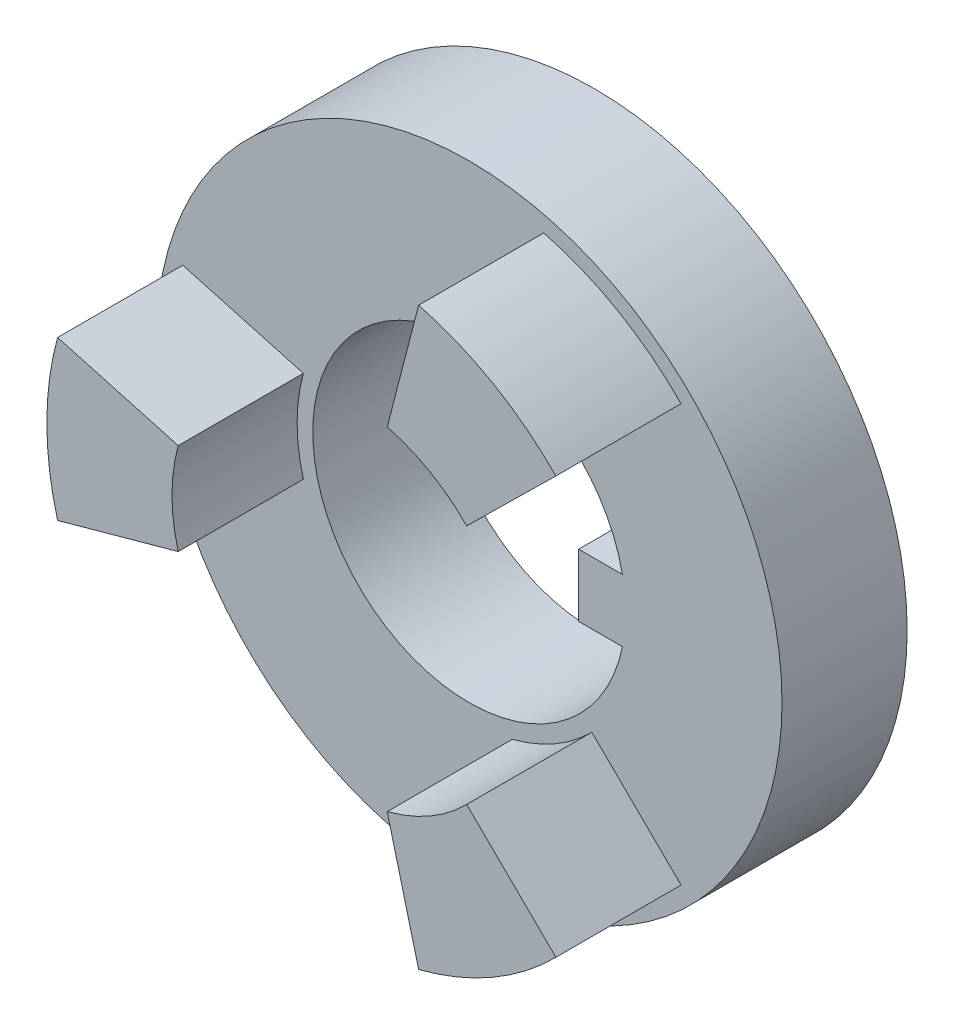
ISO-10303-21;
HEADER;
FILE_DESCRIPTION(('STEP AP214'),'2;1');
FILE_NAME('part.step','',(''),(''),'','','');
FILE_SCHEMA(('AUTOMOTIVE_DESIGN { 1 0 10303 214 1 1 1 1 }'));
ENDSEC;
DATA;
#1=APPLICATION_CONTEXT('core data for automotive mechanical design processes');
#2=APPLICATION_PROTOCOL_DEFINITION('international standard','automotive_design',2000,#1);
#3=PRODUCT_CONTEXT('',#1,'mechanical');
#4=PRODUCT('Part','Part','',(#3));
#5=PRODUCT_RELATED_PRODUCT_CATEGORY('part','',(#4));
#6=PRODUCT_DEFINITION_FORMATION('','',#4);
#7=PRODUCT_DEFINITION_CONTEXT('part definition',#1,'design');
#8=PRODUCT_DEFINITION('design','',#6,#7);
#9=PRODUCT_DEFINITION_SHAPE('','',#8);
#10=(LENGTH_UNIT() NAMED_UNIT(*) SI_UNIT(.MILLI.,.METRE.));
#11=(NAMED_UNIT(*) PLANE_ANGLE_UNIT() SI_UNIT($,.RADIAN.));
#12=(NAMED_UNIT(*) SI_UNIT($,.STERADIAN.) SOLID_ANGLE_UNIT());
#13=UNCERTAINTY_MEASURE_WITH_UNIT(LENGTH_MEASURE(1.E-05),#10,'distance_accuracy_value','');
#14=(GEOMETRIC_REPRESENTATION_CONTEXT(3) GLOBAL_UNCERTAINTY_ASSIGNED_CONTEXT((#13)) GLOBAL_UNIT_ASSIGNED_CONTEXT((#10,
#11,#12)) REPRESENTATION_CONTEXT('',''));
#15=CARTESIAN_POINT('',(0.,0.,0.));
#16=DIRECTION('',(0.,0.,1.));
#17=DIRECTION('',(1.,0.,0.));
#18=AXIS2_PLACEMENT_3D('',#15,#16,#17);
#19=CARTESIAN_POINT('',(0.,0.,4.));
#20=DIRECTION('',(0.,0.,1.));
#21=DIRECTION('',(1.,0.,0.));
#22=AXIS2_PLACEMENT_3D('',#19,#20,#21);
#23=PLANE('',#22);
#24=DIRECTION('',(-1.,0.,0.));
#25=VECTOR('',#24,1.);
#26=CARTESIAN_POINT('',(6.5,-1.,4.));
#27=LINE('',#26,#25);
#28=CARTESIAN_POINT('',(4.89897948556636,-1.,4.));
#29=VERTEX_POINT('',#28);
#30=CARTESIAN_POINT('',(3.5,-1.,4.));
#31=VERTEX_POINT('',#30);
#32=EDGE_CURVE('E156',#29,#31,#27,.T.);
#33=ORIENTED_EDGE('',*,*,#32,.F.);
#34=CARTESIAN_POINT('',(0.,0.,4.));
#35=DIRECTION('',(0.,0.,1.));
#36=DIRECTION('',(1.,0.,0.));
#37=AXIS2_PLACEMENT_3D('',#34,#35,#36);
#38=CIRCLE('',#37,5.);
#39=CARTESIAN_POINT('',(4.89897948556636,1.,4.));
#40=VERTEX_POINT('',#39);
#41=EDGE_CURVE('E164',#40,#29,#38,.T.);
#42=ORIENTED_EDGE('',*,*,#41,.F.);
#43=DIRECTION('',(1.,0.,0.));
#44=VECTOR('',#43,1.);
#45=CARTESIAN_POINT('',(6.5,1.,4.));
#46=LINE('',#45,#44);
#47=CARTESIAN_POINT('',(3.5,1.,4.));
#48=VERTEX_POINT('',#47);
#49=EDGE_CURVE('E150',#48,#40,#46,.T.);
#50=ORIENTED_EDGE('',*,*,#49,.F.);
#51=DIRECTION('',(0.,1.,0.));
#52=VECTOR('',#51,1.);
#53=CARTESIAN_POINT('',(3.5,1.,4.));
#54=LINE('',#53,#52);
#55=EDGE_CURVE('E162',#31,#48,#54,.T.);
#56=ORIENTED_EDGE('',*,*,#55,.F.);
#57=EDGE_LOOP('',(#33,#42,#50,#56));
#58=FACE_BOUND('',#57,.T.);
#59=CARTESIAN_POINT('',(0.,0.,4.));
#60=DIRECTION('',(0.,0.,1.));
#61=DIRECTION('',(1.,0.,0.));
#62=AXIS2_PLACEMENT_3D('',#59,#60,#61);
#63=CIRCLE('',#62,5.5);
#64=CARTESIAN_POINT('',(3.92058984626385,3.85732747603526,4.));
#65=VERTEX_POINT('',#64);
#66=CARTESIAN_POINT('',(1.3802486618295,5.32399414270192,4.));
#67=VERTEX_POINT('',#66);
#68=EDGE_CURVE('E177',#65,#67,#63,.T.);
#69=ORIENTED_EDGE('',*,*,#68,.T.);
#70=DIRECTION('',(0.250954302150848,0.967998935036594,0.));
#71=VECTOR('',#70,1.);
#72=CARTESIAN_POINT('',(-3.16741076286094E-13,0.,4.));
#73=LINE('',#72,#71);
#74=CARTESIAN_POINT('',(2.38406587043289,9.1959898828483,4.));
#75=VERTEX_POINT('',#74);
#76=EDGE_CURVE('E183',#67,#75,#73,.T.);
#77=ORIENTED_EDGE('',*,*,#76,.T.);
#78=CARTESIAN_POINT('',(0.,0.,4.));
#79=DIRECTION('',(0.,0.,1.));
#80=DIRECTION('',(1.,0.,0.));
#81=AXIS2_PLACEMENT_3D('',#78,#79,#80);
#82=CIRCLE('',#81,9.5);
#83=CARTESIAN_POINT('',(6.7719279162738,6.66265654951473,4.));
#84=VERTEX_POINT('',#83);
#85=EDGE_CURVE('E193',#84,#75,#82,.T.);
#86=ORIENTED_EDGE('',*,*,#85,.F.);
#87=DIRECTION('',(0.712834517502549,0.701332268369928,0.));
#88=VECTOR('',#87,1.);
#89=CARTESIAN_POINT('',(-4.08479342547263E-13,4.1517863669842E-13,4.));
#90=LINE('',#89,#88);
#91=EDGE_CURVE('E58',#65,#84,#90,.T.);
#92=ORIENTED_EDGE('',*,*,#91,.F.);
#93=EDGE_LOOP('',(#69,#77,#86,#92));
#94=FACE_BOUND('',#93,.T.);
#95=CARTESIAN_POINT('',(0.,0.,4.));
#96=DIRECTION('',(0.,0.,1.));
#97=DIRECTION('',(1.,0.,0.));
#98=AXIS2_PLACEMENT_3D('',#95,#96,#97);
#99=CIRCLE('',#98,5.5);
#100=CARTESIAN_POINT('',(1.38024866183015,-5.3239941427008,4.));
#101=VERTEX_POINT('',#100);
#102=CARTESIAN_POINT('',(3.9205898462645,-3.85732747603413,4.));
#103=VERTEX_POINT('',#102);
#104=EDGE_CURVE('E207',#101,#103,#99,.T.);
#105=ORIENTED_EDGE('',*,*,#104,.T.);
#106=DIRECTION('',(0.712834517502549,-0.701332268369927,0.));
#107=VECTOR('',#106,1.);
#108=CARTESIAN_POINT('',(4.70526837617733E-13,4.78243746070332E-13,4.));
#109=LINE('',#108,#107);
#110=CARTESIAN_POINT('',(6.7719279162747,-6.66265654951384,4.));
#111=VERTEX_POINT('',#110);
#112=EDGE_CURVE('E212',#103,#111,#109,.T.);
#113=ORIENTED_EDGE('',*,*,#112,.T.);
#114=CARTESIAN_POINT('',(0.,0.,4.));
#115=DIRECTION('',(0.,0.,1.));
#116=DIRECTION('',(1.,0.,0.));
#117=AXIS2_PLACEMENT_3D('',#114,#115,#116);
#118=CIRCLE('',#117,9.5);
#119=CARTESIAN_POINT('',(2.38406587043363,-9.1959898828475,4.));
#120=VERTEX_POINT('',#119);
#121=EDGE_CURVE('E224',#120,#111,#118,.T.);
#122=ORIENTED_EDGE('',*,*,#121,.F.);
#123=DIRECTION('',(0.250954302150849,-0.967998935036594,0.));
#124=VECTOR('',#123,1.);
#125=CARTESIAN_POINT('',(5.63165213834055E-13,1.46000918098134E-13,4.));
#126=LINE('',#125,#124);
#127=EDGE_CURVE('E221',#101,#120,#126,.T.);
#128=ORIENTED_EDGE('',*,*,#127,.F.);
#129=EDGE_LOOP('',(#105,#113,#122,#128));
#130=FACE_BOUND('',#129,.T.);
#131=CARTESIAN_POINT('',(0.,0.,4.));
#132=DIRECTION('',(0.,0.,1.));
#133=DIRECTION('',(1.,0.,0.));
#134=AXIS2_PLACEMENT_3D('',#131,#132,#133);
#135=CIRCLE('',#134,5.5);
#136=CARTESIAN_POINT('',(-5.30083850809369,1.46666666666667,4.));
#137=VERTEX_POINT('',#136);
#138=CARTESIAN_POINT('',(-5.30083850809369,-1.46666666666666,4.));
#139=VERTEX_POINT('',#138);
#140=EDGE_CURVE('E239',#137,#139,#135,.T.);
#141=ORIENTED_EDGE('',*,*,#140,.T.);
#142=DIRECTION('',(-0.963788819653398,-0.266666666666666,0.));
#143=VECTOR('',#142,1.);
#144=CARTESIAN_POINT('',(0.,0.,4.));
#145=LINE('',#144,#143);
#146=CARTESIAN_POINT('',(-9.15599378670728,-2.53333333333333,4.));
#147=VERTEX_POINT('',#146);
#148=EDGE_CURVE('E244',#139,#147,#145,.T.);
#149=ORIENTED_EDGE('',*,*,#148,.T.);
#150=CARTESIAN_POINT('',(0.,0.,4.));
#151=DIRECTION('',(0.,0.,1.));
#152=DIRECTION('',(1.,0.,0.));
#153=AXIS2_PLACEMENT_3D('',#150,#151,#152);
#154=CIRCLE('',#153,9.5);
#155=CARTESIAN_POINT('',(-9.15599378670728,2.53333333333333,4.));
#156=VERTEX_POINT('',#155);
#157=EDGE_CURVE('E256',#156,#147,#154,.T.);
#158=ORIENTED_EDGE('',*,*,#157,.F.);
#159=DIRECTION('',(-0.963788819653397,0.266666666666667,0.));
#160=VECTOR('',#159,1.);
#161=CARTESIAN_POINT('',(0.,0.,4.));
#162=LINE('',#161,#160);
#163=EDGE_CURVE('E253',#137,#156,#162,.T.);
#164=ORIENTED_EDGE('',*,*,#163,.F.);
#165=EDGE_LOOP('',(#141,#149,#158,#164));
#166=FACE_BOUND('',#165,.T.);
#167=CARTESIAN_POINT('',(0.,0.,4.));
#168=DIRECTION('',(0.,0.,1.));
#169=DIRECTION('',(1.,0.,0.));
#170=AXIS2_PLACEMENT_3D('',#167,#168,#169);
#171=CIRCLE('',#170,10.);
#172=CARTESIAN_POINT('',(10.,0.,4.));
#173=VERTEX_POINT('',#172);
#174=EDGE_CURVE('E275',#173,#173,#171,.T.);
#175=ORIENTED_EDGE('',*,*,#174,.T.);
#176=EDGE_LOOP('',(#175));
#177=FACE_BOUND('',#176,.T.);
#178=ADVANCED_FACE('F35',(#58,#94,#130,#166,#177),#23,.T.);
#179=CARTESIAN_POINT('',(0.,0.,0.));
#180=DIRECTION('',(0.,0.,1.));
#181=DIRECTION('',(1.,0.,0.));
#182=AXIS2_PLACEMENT_3D('',#179,#180,#181);
#183=PLANE('',#182);
#184=CARTESIAN_POINT('',(0.,0.,0.));
#185=DIRECTION('',(0.,0.,1.));
#186=DIRECTION('',(1.,0.,0.));
#187=AXIS2_PLACEMENT_3D('',#184,#185,#186);
#188=CIRCLE('',#187,10.);
#189=CARTESIAN_POINT('',(10.,0.,0.));
#190=VERTEX_POINT('',#189);
#191=EDGE_CURVE('E273',#190,#190,#188,.T.);
#192=ORIENTED_EDGE('',*,*,#191,.F.);
#193=EDGE_LOOP('',(#192));
#194=FACE_BOUND('',#193,.T.);
#195=CARTESIAN_POINT('',(0.,0.,0.));
#196=DIRECTION('',(0.,0.,1.));
#197=DIRECTION('',(1.,0.,0.));
#198=AXIS2_PLACEMENT_3D('',#195,#196,#197);
#199=CIRCLE('',#198,5.);
#200=CARTESIAN_POINT('',(4.89897948556636,1.,0.));
#201=VERTEX_POINT('',#200);
#202=CARTESIAN_POINT('',(4.89897948556636,-1.,0.));
#203=VERTEX_POINT('',#202);
#204=EDGE_CURVE('E271',#201,#203,#199,.T.);
#205=ORIENTED_EDGE('',*,*,#204,.T.);
#206=DIRECTION('',(-1.,0.,0.));
#207=VECTOR('',#206,1.);
#208=CARTESIAN_POINT('',(6.5,-1.,0.));
#209=LINE('',#208,#207);
#210=CARTESIAN_POINT('',(3.5,-1.,0.));
#211=VERTEX_POINT('',#210);
#212=EDGE_CURVE('E169',#203,#211,#209,.T.);
#213=ORIENTED_EDGE('',*,*,#212,.T.);
#214=DIRECTION('',(0.,1.,0.));
#215=VECTOR('',#214,1.);
#216=CARTESIAN_POINT('',(3.5,1.,0.));
#217=LINE('',#216,#215);
#218=CARTESIAN_POINT('',(3.5,1.,0.));
#219=VERTEX_POINT('',#218);
#220=EDGE_CURVE('E174',#211,#219,#217,.T.);
#221=ORIENTED_EDGE('',*,*,#220,.T.);
#222=DIRECTION('',(1.,0.,0.));
#223=VECTOR('',#222,1.);
#224=CARTESIAN_POINT('',(6.5,1.,0.));
#225=LINE('',#224,#223);
#226=EDGE_CURVE('E50',#219,#201,#225,.T.);
#227=ORIENTED_EDGE('',*,*,#226,.T.);
#228=EDGE_LOOP('',(#205,#213,#221,#227));
#229=FACE_BOUND('',#228,.T.);
#230=ADVANCED_FACE('F283',(#194,#229),#183,.F.);
#231=CARTESIAN_POINT('',(0.,0.,4.));
#232=DIRECTION('',(0.,0.,-1.));
#233=DIRECTION('',(-1.,0.,0.));
#234=AXIS2_PLACEMENT_3D('',#231,#232,#233);
#235=CYLINDRICAL_SURFACE('',#234,10.);
#236=ORIENTED_EDGE('',*,*,#174,.F.);
#237=EDGE_LOOP('',(#236));
#238=FACE_BOUND('',#237,.T.);
#239=ORIENTED_EDGE('',*,*,#191,.T.);
#240=EDGE_LOOP('',(#239));
#241=FACE_BOUND('',#240,.T.);
#242=ADVANCED_FACE('F37',(#238,#241),#235,.T.);
#243=CARTESIAN_POINT('',(0.,0.,4.));
#244=DIRECTION('',(0.,0.,-1.));
#245=DIRECTION('',(-1.,0.,0.));
#246=AXIS2_PLACEMENT_3D('',#243,#244,#245);
#247=CYLINDRICAL_SURFACE('',#246,5.);
#248=DIRECTION('',(0.,0.,-1.));
#249=VECTOR('',#248,1.);
#250=CARTESIAN_POINT('',(4.89897948556636,-1.,4.));
#251=LINE('',#250,#249);
#252=EDGE_CURVE('E11',#203,#29,#251,.F.);
#253=ORIENTED_EDGE('',*,*,#252,.F.);
#254=ORIENTED_EDGE('',*,*,#204,.F.);
#255=DIRECTION('',(0.,0.,-1.));
#256=VECTOR('',#255,1.);
#257=CARTESIAN_POINT('',(4.89897948556636,1.,4.));
#258=LINE('',#257,#256);
#259=EDGE_CURVE('E43',#40,#201,#258,.T.);
#260=ORIENTED_EDGE('',*,*,#259,.F.);
#261=ORIENTED_EDGE('',*,*,#41,.T.);
#262=EDGE_LOOP('',(#253,#254,#260,#261));
#263=FACE_BOUND('',#262,.T.);
#264=ADVANCED_FACE('F282',(#263),#247,.F.);
#265=CARTESIAN_POINT('',(0.,0.,8.));
#266=DIRECTION('',(0.,0.,-1.));
#267=DIRECTION('',(-1.,0.,0.));
#268=AXIS2_PLACEMENT_3D('',#265,#266,#267);
#269=CYLINDRICAL_SURFACE('',#268,5.5);
#270=ORIENTED_EDGE('',*,*,#140,.F.);
#271=DIRECTION('',(0.,0.,-1.));
#272=VECTOR('',#271,1.);
#273=CARTESIAN_POINT('',(-5.30083850809369,1.46666666666667,8.));
#274=LINE('',#273,#272);
#275=CARTESIAN_POINT('',(-5.30083850809369,1.46666666666667,8.));
#276=VERTEX_POINT('',#275);
#277=EDGE_CURVE('E268',#276,#137,#274,.T.);
#278=ORIENTED_EDGE('',*,*,#277,.F.);
#279=CARTESIAN_POINT('',(0.,0.,8.));
#280=DIRECTION('',(0.,0.,1.));
#281=DIRECTION('',(1.,0.,0.));
#282=AXIS2_PLACEMENT_3D('',#279,#280,#281);
#283=CIRCLE('',#282,5.5);
#284=CARTESIAN_POINT('',(-5.30083850809369,-1.46666666666666,8.));
#285=VERTEX_POINT('',#284);
#286=EDGE_CURVE('E240',#276,#285,#283,.T.);
#287=ORIENTED_EDGE('',*,*,#286,.T.);
#288=DIRECTION('',(0.,0.,-1.));
#289=VECTOR('',#288,1.);
#290=CARTESIAN_POINT('',(-5.30083850809369,-1.46666666666666,8.));
#291=LINE('',#290,#289);
#292=EDGE_CURVE('E251',#285,#139,#291,.T.);
#293=ORIENTED_EDGE('',*,*,#292,.T.);
#294=EDGE_LOOP('',(#270,#278,#287,#293));
#295=FACE_BOUND('',#294,.T.);
#296=ADVANCED_FACE('F304',(#295),#269,.F.);
#297=CARTESIAN_POINT('',(0.,0.,8.));
#298=DIRECTION('',(-0.266666666666667,-0.963788819653397,0.));
#299=DIRECTION('',(0.963788819653397,-0.266666666666667,0.));
#300=AXIS2_PLACEMENT_3D('',#297,#298,#299);
#301=PLANE('',#300);
#302=ORIENTED_EDGE('',*,*,#163,.T.);
#303=DIRECTION('',(0.,0.,-1.));
#304=VECTOR('',#303,1.);
#305=CARTESIAN_POINT('',(-9.15599378670728,2.53333333333333,8.));
#306=LINE('',#305,#304);
#307=CARTESIAN_POINT('',(-9.15599378670728,2.53333333333333,8.));
#308=VERTEX_POINT('',#307);
#309=EDGE_CURVE('E265',#308,#156,#306,.T.);
#310=ORIENTED_EDGE('',*,*,#309,.F.);
#311=DIRECTION('',(-0.963788819653397,0.266666666666667,0.));
#312=VECTOR('',#311,1.);
#313=CARTESIAN_POINT('',(0.,0.,8.));
#314=LINE('',#313,#312);
#315=EDGE_CURVE('E243',#276,#308,#314,.T.);
#316=ORIENTED_EDGE('',*,*,#315,.F.);
#317=ORIENTED_EDGE('',*,*,#277,.T.);
#318=EDGE_LOOP('',(#302,#310,#316,#317));
#319=FACE_BOUND('',#318,.T.);
#320=ADVANCED_FACE('F307',(#319),#301,.F.);
#321=CARTESIAN_POINT('',(0.,0.,8.));
#322=DIRECTION('',(0.,0.,-1.));
#323=DIRECTION('',(-1.,0.,0.));
#324=AXIS2_PLACEMENT_3D('',#321,#322,#323);
#325=CYLINDRICAL_SURFACE('',#324,9.5);
#326=ORIENTED_EDGE('',*,*,#157,.T.);
#327=DIRECTION('',(0.,0.,-1.));
#328=VECTOR('',#327,1.);
#329=CARTESIAN_POINT('',(-9.15599378670728,-2.53333333333333,8.));
#330=LINE('',#329,#328);
#331=CARTESIAN_POINT('',(-9.15599378670728,-2.53333333333333,8.));
#332=VERTEX_POINT('',#331);
#333=EDGE_CURVE('E262',#332,#147,#330,.T.);
#334=ORIENTED_EDGE('',*,*,#333,.F.);
#335=CARTESIAN_POINT('',(0.,0.,8.));
#336=DIRECTION('',(0.,0.,1.));
#337=DIRECTION('',(1.,0.,0.));
#338=AXIS2_PLACEMENT_3D('',#335,#336,#337);
#339=CIRCLE('',#338,9.5);
#340=EDGE_CURVE('E246',#308,#332,#339,.T.);
#341=ORIENTED_EDGE('',*,*,#340,.F.);
#342=ORIENTED_EDGE('',*,*,#309,.T.);
#343=EDGE_LOOP('',(#326,#334,#341,#342));
#344=FACE_BOUND('',#343,.T.);
#345=ADVANCED_FACE('F311',(#344),#325,.T.);
#346=CARTESIAN_POINT('',(0.,0.,8.));
#347=DIRECTION('',(0.266666666666666,-0.963788819653398,0.));
#348=DIRECTION('',(0.963788819653398,0.266666666666666,0.));
#349=AXIS2_PLACEMENT_3D('',#346,#347,#348);
#350=PLANE('',#349);
#351=ORIENTED_EDGE('',*,*,#148,.F.);
#352=ORIENTED_EDGE('',*,*,#292,.F.);
#353=DIRECTION('',(-0.963788819653398,-0.266666666666666,0.));
#354=VECTOR('',#353,1.);
#355=CARTESIAN_POINT('',(0.,0.,8.));
#356=LINE('',#355,#354);
#357=EDGE_CURVE('E248',#285,#332,#356,.T.);
#358=ORIENTED_EDGE('',*,*,#357,.T.);
#359=ORIENTED_EDGE('',*,*,#333,.T.);
#360=EDGE_LOOP('',(#351,#352,#358,#359));
#361=FACE_BOUND('',#360,.T.);
#362=ADVANCED_FACE('F315',(#361),#350,.T.);
#363=CARTESIAN_POINT('',(0.,0.,8.));
#364=DIRECTION('',(0.,0.,1.));
#365=DIRECTION('',(1.,0.,0.));
#366=AXIS2_PLACEMENT_3D('',#363,#364,#365);
#367=PLANE('',#366);
#368=ORIENTED_EDGE('',*,*,#286,.F.);
#369=ORIENTED_EDGE('',*,*,#315,.T.);
#370=ORIENTED_EDGE('',*,*,#340,.T.);
#371=ORIENTED_EDGE('',*,*,#357,.F.);
#372=EDGE_LOOP('',(#368,#369,#370,#371));
#373=FACE_BOUND('',#372,.T.);
#374=ADVANCED_FACE('F319',(#373),#367,.T.);
#375=CARTESIAN_POINT('',(0.,0.,8.));
#376=DIRECTION('',(0.,0.,-1.));
#377=DIRECTION('',(-1.,0.,0.));
#378=AXIS2_PLACEMENT_3D('',#375,#376,#377);
#379=CYLINDRICAL_SURFACE('',#378,5.5);
#380=ORIENTED_EDGE('',*,*,#104,.F.);
#381=DIRECTION('',(0.,0.,-1.));
#382=VECTOR('',#381,1.);
#383=CARTESIAN_POINT('',(1.38024866183015,-5.3239941427008,8.));
#384=LINE('',#383,#382);
#385=CARTESIAN_POINT('',(1.38024866183015,-5.3239941427008,8.));
#386=VERTEX_POINT('',#385);
#387=EDGE_CURVE('E236',#386,#101,#384,.T.);
#388=ORIENTED_EDGE('',*,*,#387,.F.);
#389=CARTESIAN_POINT('',(0.,0.,8.));
#390=DIRECTION('',(0.,0.,1.));
#391=DIRECTION('',(1.,0.,0.));
#392=AXIS2_PLACEMENT_3D('',#389,#390,#391);
#393=CIRCLE('',#392,5.5);
#394=CARTESIAN_POINT('',(3.9205898462645,-3.85732747603413,8.));
#395=VERTEX_POINT('',#394);
#396=EDGE_CURVE('E208',#386,#395,#393,.T.);
#397=ORIENTED_EDGE('',*,*,#396,.T.);
#398=DIRECTION('',(0.,0.,-1.));
#399=VECTOR('',#398,1.);
#400=CARTESIAN_POINT('',(3.9205898462645,-3.85732747603413,8.));
#401=LINE('',#400,#399);
#402=EDGE_CURVE('E219',#395,#103,#401,.T.);
#403=ORIENTED_EDGE('',*,*,#402,.T.);
#404=EDGE_LOOP('',(#380,#388,#397,#403));
#405=FACE_BOUND('',#404,.T.);
#406=ADVANCED_FACE('F323',(#405),#379,.F.);
#407=CARTESIAN_POINT('',(5.63165213834055E-13,1.46000918098134E-13,8.));
#408=DIRECTION('',(0.967998935036594,0.250954302150849,0.));
#409=DIRECTION('',(-0.250954302150849,0.967998935036594,0.));
#410=AXIS2_PLACEMENT_3D('',#407,#408,#409);
#411=PLANE('',#410);
#412=ORIENTED_EDGE('',*,*,#127,.T.);
#413=DIRECTION('',(0.,0.,-1.));
#414=VECTOR('',#413,1.);
#415=CARTESIAN_POINT('',(2.38406587043355,-9.19598988284717,8.));
#416=LINE('',#415,#414);
#417=CARTESIAN_POINT('',(2.38406587043355,-9.19598988284717,8.));
#418=VERTEX_POINT('',#417);
#419=EDGE_CURVE('E233',#418,#120,#416,.T.);
#420=ORIENTED_EDGE('',*,*,#419,.F.);
#421=DIRECTION('',(0.250954302150849,-0.967998935036594,0.));
#422=VECTOR('',#421,1.);
#423=CARTESIAN_POINT('',(5.63165213834055E-13,1.46000918098134E-13,8.));
#424=LINE('',#423,#422);
#425=EDGE_CURVE('E211',#386,#418,#424,.T.);
#426=ORIENTED_EDGE('',*,*,#425,.F.);
#427=ORIENTED_EDGE('',*,*,#387,.T.);
#428=EDGE_LOOP('',(#412,#420,#426,#427));
#429=FACE_BOUND('',#428,.T.);
#430=ADVANCED_FACE('F327',(#429),#411,.F.);
#431=CARTESIAN_POINT('',(0.,0.,8.));
#432=DIRECTION('',(0.,0.,-1.));
#433=DIRECTION('',(-1.,0.,0.));
#434=AXIS2_PLACEMENT_3D('',#431,#432,#433);
#435=CYLINDRICAL_SURFACE('',#434,9.5);
#436=ORIENTED_EDGE('',*,*,#121,.T.);
#437=DIRECTION('',(0.,0.,-1.));
#438=VECTOR('',#437,1.);
#439=CARTESIAN_POINT('',(6.7719279162747,-6.66265654951384,8.));
#440=LINE('',#439,#438);
#441=CARTESIAN_POINT('',(6.7719279162747,-6.66265654951384,8.));
#442=VERTEX_POINT('',#441);
#443=EDGE_CURVE('E230',#442,#111,#440,.T.);
#444=ORIENTED_EDGE('',*,*,#443,.F.);
#445=CARTESIAN_POINT('',(0.,0.,8.));
#446=DIRECTION('',(0.,0.,1.));
#447=DIRECTION('',(1.,0.,0.));
#448=AXIS2_PLACEMENT_3D('',#445,#446,#447);
#449=CIRCLE('',#448,9.5);
#450=EDGE_CURVE('E214',#418,#442,#449,.T.);
#451=ORIENTED_EDGE('',*,*,#450,.F.);
#452=ORIENTED_EDGE('',*,*,#419,.T.);
#453=EDGE_LOOP('',(#436,#444,#451,#452));
#454=FACE_BOUND('',#453,.T.);
#455=ADVANCED_FACE('F331',(#454),#435,.T.);
#456=CARTESIAN_POINT('',(4.70526837617733E-13,4.78243746070332E-13,8.));
#457=DIRECTION('',(0.701332268369927,0.712834517502549,0.));
#458=DIRECTION('',(-0.712834517502549,0.701332268369927,0.));
#459=AXIS2_PLACEMENT_3D('',#456,#457,#458);
#460=PLANE('',#459);
#461=ORIENTED_EDGE('',*,*,#112,.F.);
#462=ORIENTED_EDGE('',*,*,#402,.F.);
#463=DIRECTION('',(0.712834517502549,-0.701332268369927,0.));
#464=VECTOR('',#463,1.);
#465=CARTESIAN_POINT('',(4.70526837617733E-13,4.78243746070332E-13,8.));
#466=LINE('',#465,#464);
#467=EDGE_CURVE('E216',#395,#442,#466,.T.);
#468=ORIENTED_EDGE('',*,*,#467,.T.);
#469=ORIENTED_EDGE('',*,*,#443,.T.);
#470=EDGE_LOOP('',(#461,#462,#468,#469));
#471=FACE_BOUND('',#470,.T.);
#472=ADVANCED_FACE('F335',(#471),#460,.T.);
#473=CARTESIAN_POINT('',(0.,0.,8.));
#474=DIRECTION('',(0.,0.,1.));
#475=DIRECTION('',(1.,0.,0.));
#476=AXIS2_PLACEMENT_3D('',#473,#474,#475);
#477=PLANE('',#476);
#478=ORIENTED_EDGE('',*,*,#396,.F.);
#479=ORIENTED_EDGE('',*,*,#425,.T.);
#480=ORIENTED_EDGE('',*,*,#450,.T.);
#481=ORIENTED_EDGE('',*,*,#467,.F.);
#482=EDGE_LOOP('',(#478,#479,#480,#481));
#483=FACE_BOUND('',#482,.T.);
#484=ADVANCED_FACE('F339',(#483),#477,.T.);
#485=CARTESIAN_POINT('',(0.,0.,8.));
#486=DIRECTION('',(0.,0.,-1.));
#487=DIRECTION('',(-1.,0.,0.));
#488=AXIS2_PLACEMENT_3D('',#485,#486,#487);
#489=CYLINDRICAL_SURFACE('',#488,5.5);
#490=ORIENTED_EDGE('',*,*,#68,.F.);
#491=DIRECTION('',(0.,0.,-1.));
#492=VECTOR('',#491,1.);
#493=CARTESIAN_POINT('',(3.92058984626385,3.85732747603526,8.));
#494=LINE('',#493,#492);
#495=CARTESIAN_POINT('',(3.92058984626385,3.85732747603526,8.));
#496=VERTEX_POINT('',#495);
#497=EDGE_CURVE('E205',#496,#65,#494,.T.);
#498=ORIENTED_EDGE('',*,*,#497,.F.);
#499=CARTESIAN_POINT('',(0.,0.,8.));
#500=DIRECTION('',(0.,0.,1.));
#501=DIRECTION('',(1.,0.,0.));
#502=AXIS2_PLACEMENT_3D('',#499,#500,#501);
#503=CIRCLE('',#502,5.5);
#504=CARTESIAN_POINT('',(1.3802486618295,5.32399414270192,8.));
#505=VERTEX_POINT('',#504);
#506=EDGE_CURVE('E179',#496,#505,#503,.T.);
#507=ORIENTED_EDGE('',*,*,#506,.T.);
#508=DIRECTION('',(0.,0.,-1.));
#509=VECTOR('',#508,1.);
#510=CARTESIAN_POINT('',(1.3802486618295,5.32399414270192,8.));
#511=LINE('',#510,#509);
#512=EDGE_CURVE('E190',#505,#67,#511,.T.);
#513=ORIENTED_EDGE('',*,*,#512,.T.);
#514=EDGE_LOOP('',(#490,#498,#507,#513));
#515=FACE_BOUND('',#514,.T.);
#516=ADVANCED_FACE('F343',(#515),#489,.F.);
#517=CARTESIAN_POINT('',(-4.08479342547263E-13,4.1517863669842E-13,8.));
#518=DIRECTION('',(-0.701332268369928,0.712834517502549,0.));
#519=DIRECTION('',(-0.712834517502549,-0.701332268369928,0.));
#520=AXIS2_PLACEMENT_3D('',#517,#518,#519);
#521=PLANE('',#520);
#522=ORIENTED_EDGE('',*,*,#91,.T.);
#523=DIRECTION('',(0.,0.,-1.));
#524=VECTOR('',#523,1.);
#525=CARTESIAN_POINT('',(6.77192791627404,6.66265654951497,8.));
#526=LINE('',#525,#524);
#527=CARTESIAN_POINT('',(6.77192791627404,6.66265654951497,8.));
#528=VERTEX_POINT('',#527);
#529=EDGE_CURVE('E202',#528,#84,#526,.T.);
#530=ORIENTED_EDGE('',*,*,#529,.F.);
#531=DIRECTION('',(0.712834517502549,0.701332268369928,0.));
#532=VECTOR('',#531,1.);
#533=CARTESIAN_POINT('',(-4.08479342547263E-13,4.1517863669842E-13,8.));
#534=LINE('',#533,#532);
#535=EDGE_CURVE('E182',#496,#528,#534,.T.);
#536=ORIENTED_EDGE('',*,*,#535,.F.);
#537=ORIENTED_EDGE('',*,*,#497,.T.);
#538=EDGE_LOOP('',(#522,#530,#536,#537));
#539=FACE_BOUND('',#538,.T.);
#540=ADVANCED_FACE('F347',(#539),#521,.F.);
#541=CARTESIAN_POINT('',(0.,0.,8.));
#542=DIRECTION('',(0.,0.,-1.));
#543=DIRECTION('',(-1.,0.,0.));
#544=AXIS2_PLACEMENT_3D('',#541,#542,#543);
#545=CYLINDRICAL_SURFACE('',#544,9.5);
#546=ORIENTED_EDGE('',*,*,#85,.T.);
#547=DIRECTION('',(0.,0.,-1.));
#548=VECTOR('',#547,1.);
#549=CARTESIAN_POINT('',(2.38406587043289,9.1959898828483,8.));
#550=LINE('',#549,#548);
#551=CARTESIAN_POINT('',(2.38406587043289,9.1959898828483,8.));
#552=VERTEX_POINT('',#551);
#553=EDGE_CURVE('E199',#552,#75,#550,.T.);
#554=ORIENTED_EDGE('',*,*,#553,.F.);
#555=CARTESIAN_POINT('',(0.,0.,8.));
#556=DIRECTION('',(0.,0.,1.));
#557=DIRECTION('',(1.,0.,0.));
#558=AXIS2_PLACEMENT_3D('',#555,#556,#557);
#559=CIRCLE('',#558,9.5);
#560=EDGE_CURVE('E185',#528,#552,#559,.T.);
#561=ORIENTED_EDGE('',*,*,#560,.F.);
#562=ORIENTED_EDGE('',*,*,#529,.T.);
#563=EDGE_LOOP('',(#546,#554,#561,#562));
#564=FACE_BOUND('',#563,.T.);
#565=ADVANCED_FACE('F351',(#564),#545,.T.);
#566=CARTESIAN_POINT('',(-3.16741076286094E-13,0.,8.));
#567=DIRECTION('',(-0.967998935036594,0.250954302150848,0.));
#568=DIRECTION('',(-0.250954302150848,-0.967998935036594,0.));
#569=AXIS2_PLACEMENT_3D('',#566,#567,#568);
#570=PLANE('',#569);
#571=ORIENTED_EDGE('',*,*,#76,.F.);
#572=ORIENTED_EDGE('',*,*,#512,.F.);
#573=DIRECTION('',(0.250954302150848,0.967998935036594,0.));
#574=VECTOR('',#573,1.);
#575=CARTESIAN_POINT('',(-3.16741076286094E-13,0.,8.));
#576=LINE('',#575,#574);
#577=EDGE_CURVE('E187',#505,#552,#576,.T.);
#578=ORIENTED_EDGE('',*,*,#577,.T.);
#579=ORIENTED_EDGE('',*,*,#553,.T.);
#580=EDGE_LOOP('',(#571,#572,#578,#579));
#581=FACE_BOUND('',#580,.T.);
#582=ADVANCED_FACE('F355',(#581),#570,.T.);
#583=CARTESIAN_POINT('',(0.,0.,8.));
#584=DIRECTION('',(0.,0.,1.));
#585=DIRECTION('',(1.,0.,0.));
#586=AXIS2_PLACEMENT_3D('',#583,#584,#585);
#587=PLANE('',#586);
#588=ORIENTED_EDGE('',*,*,#506,.F.);
#589=ORIENTED_EDGE('',*,*,#535,.T.);
#590=ORIENTED_EDGE('',*,*,#560,.T.);
#591=ORIENTED_EDGE('',*,*,#577,.F.);
#592=EDGE_LOOP('',(#588,#589,#590,#591));
#593=FACE_BOUND('',#592,.T.);
#594=ADVANCED_FACE('F293',(#593),#587,.T.);
#595=CARTESIAN_POINT('',(3.5,1.,4.));
#596=DIRECTION('',(-1.,0.,0.));
#597=DIRECTION('',(0.,0.,1.));
#598=AXIS2_PLACEMENT_3D('',#595,#596,#597);
#599=PLANE('',#598);
#600=ORIENTED_EDGE('',*,*,#220,.F.);
#601=DIRECTION('',(0.,0.,-1.));
#602=VECTOR('',#601,1.);
#603=CARTESIAN_POINT('',(3.5,-1.,4.));
#604=LINE('',#603,#602);
#605=EDGE_CURVE('E155',#31,#211,#604,.T.);
#606=ORIENTED_EDGE('',*,*,#605,.F.);
#607=ORIENTED_EDGE('',*,*,#55,.T.);
#608=DIRECTION('',(0.,0.,-1.));
#609=VECTOR('',#608,1.);
#610=CARTESIAN_POINT('',(3.5,1.,4.));
#611=LINE('',#610,#609);
#612=EDGE_CURVE('E147',#48,#219,#611,.T.);
#613=ORIENTED_EDGE('',*,*,#612,.T.);
#614=EDGE_LOOP('',(#600,#606,#607,#613));
#615=FACE_BOUND('',#614,.T.);
#616=ADVANCED_FACE('F167',(#615),#599,.T.);
#617=CARTESIAN_POINT('',(6.5,-1.,4.));
#618=DIRECTION('',(0.,-1.,0.));
#619=DIRECTION('',(0.,0.,-1.));
#620=AXIS2_PLACEMENT_3D('',#617,#618,#619);
#621=PLANE('',#620);
#622=ORIENTED_EDGE('',*,*,#212,.F.);
#623=ORIENTED_EDGE('',*,*,#252,.T.);
#624=ORIENTED_EDGE('',*,*,#32,.T.);
#625=ORIENTED_EDGE('',*,*,#605,.T.);
#626=EDGE_LOOP('',(#622,#623,#624,#625));
#627=FACE_BOUND('',#626,.T.);
#628=ADVANCED_FACE('F285',(#627),#621,.T.);
#629=CARTESIAN_POINT('',(6.5,1.,4.));
#630=DIRECTION('',(0.,1.,0.));
#631=DIRECTION('',(0.,0.,1.));
#632=AXIS2_PLACEMENT_3D('',#629,#630,#631);
#633=PLANE('',#632);
#634=ORIENTED_EDGE('',*,*,#49,.T.);
#635=ORIENTED_EDGE('',*,*,#259,.T.);
#636=ORIENTED_EDGE('',*,*,#226,.F.);
#637=ORIENTED_EDGE('',*,*,#612,.F.);
#638=EDGE_LOOP('',(#634,#635,#636,#637));
#639=FACE_BOUND('',#638,.T.);
#640=ADVANCED_FACE('F149',(#639),#633,.T.);
#641=CLOSED_SHELL('',(#178,#230,#242,#264,#296,#320,#345,#362,#374,#406,#430,#455,#472,#484,
#516,#540,#565,#582,#594,#616,#628,#640));
#642=MANIFOLD_SOLID_BREP('B2',#641);
#643=ADVANCED_BREP_SHAPE_REPRESENTATION('',(#18,#642),#14);
#644=SHAPE_DEFINITION_REPRESENTATION(#9,#643);
ENDSEC;
END-ISO-10303-21;
